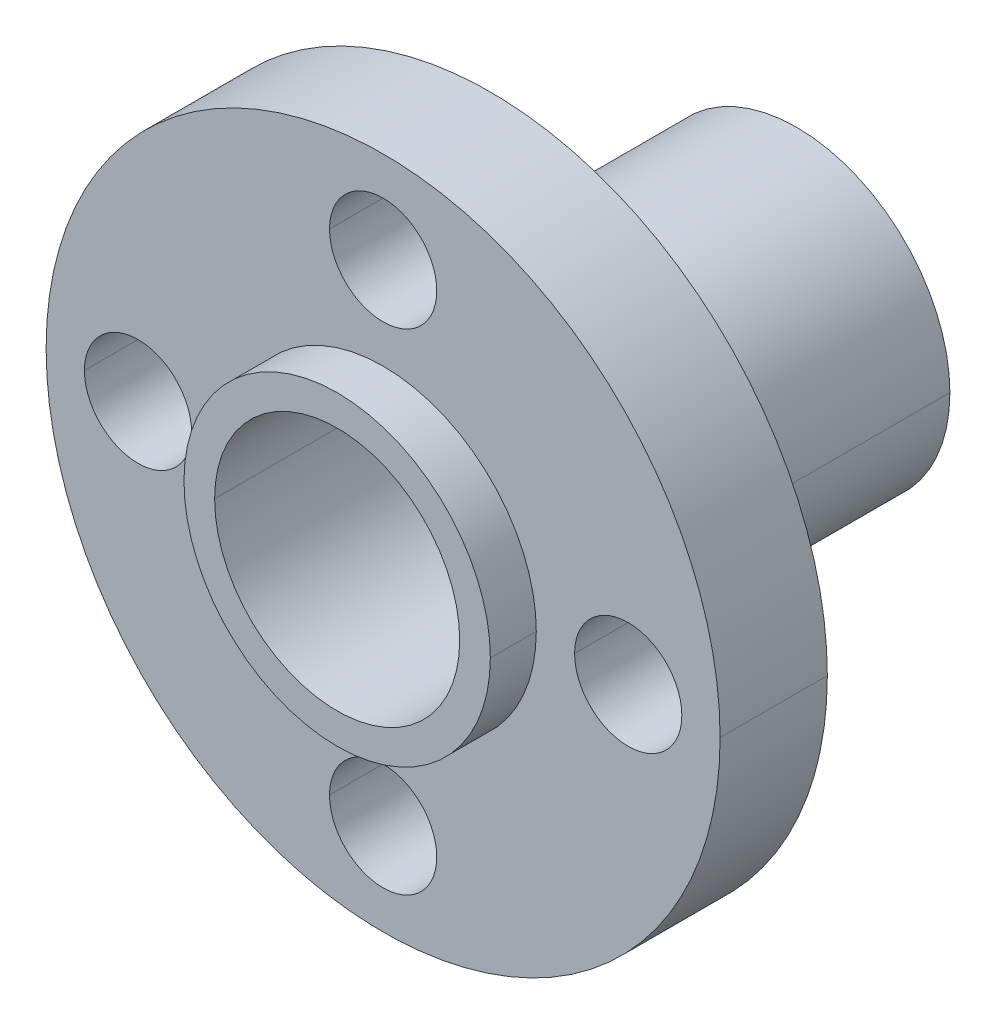
ISO-10303-21;
HEADER;
FILE_DESCRIPTION(('STEP AP214'),'2;1');
FILE_NAME('part.step','',(''),(''),'','','');
FILE_SCHEMA(('AUTOMOTIVE_DESIGN { 1 0 10303 214 1 1 1 1 }'));
ENDSEC;
DATA;
#1=APPLICATION_CONTEXT('core data for automotive mechanical design processes');
#2=APPLICATION_PROTOCOL_DEFINITION('international standard','automotive_design',2000,#1);
#3=PRODUCT_CONTEXT('',#1,'mechanical');
#4=PRODUCT('Part','Part','',(#3));
#5=PRODUCT_RELATED_PRODUCT_CATEGORY('part','',(#4));
#6=PRODUCT_DEFINITION_FORMATION('','',#4);
#7=PRODUCT_DEFINITION_CONTEXT('part definition',#1,'design');
#8=PRODUCT_DEFINITION('design','',#6,#7);
#9=PRODUCT_DEFINITION_SHAPE('','',#8);
#10=(LENGTH_UNIT() NAMED_UNIT(*) SI_UNIT(.MILLI.,.METRE.));
#11=(NAMED_UNIT(*) PLANE_ANGLE_UNIT() SI_UNIT($,.RADIAN.));
#12=(NAMED_UNIT(*) SI_UNIT($,.STERADIAN.) SOLID_ANGLE_UNIT());
#13=UNCERTAINTY_MEASURE_WITH_UNIT(LENGTH_MEASURE(1.E-05),#10,'distance_accuracy_value','');
#14=(GEOMETRIC_REPRESENTATION_CONTEXT(3) GLOBAL_UNCERTAINTY_ASSIGNED_CONTEXT((#13)) GLOBAL_UNIT_ASSIGNED_CONTEXT((#10,
#11,#12)) REPRESENTATION_CONTEXT('',''));
#15=CARTESIAN_POINT('',(0.,0.,0.));
#16=DIRECTION('',(0.,0.,1.));
#17=DIRECTION('',(1.,0.,0.));
#18=AXIS2_PLACEMENT_3D('',#15,#16,#17);
#19=CARTESIAN_POINT('',(0.,0.,-10.));
#20=DIRECTION('',(0.,0.,1.));
#21=DIRECTION('',(1.,0.,0.));
#22=AXIS2_PLACEMENT_3D('',#19,#20,#21);
#23=CYLINDRICAL_SURFACE('',#22,5.);
#24=CARTESIAN_POINT('',(0.,0.,-10.));
#25=DIRECTION('',(0.,0.,1.));
#26=DIRECTION('',(1.,0.,0.));
#27=AXIS2_PLACEMENT_3D('',#24,#25,#26);
#28=CIRCLE('',#27,5.);
#29=CARTESIAN_POINT('',(5.,0.,-10.));
#30=VERTEX_POINT('',#29);
#31=CARTESIAN_POINT('',(-5.,0.,-10.));
#32=VERTEX_POINT('',#31);
#33=EDGE_CURVE('E230',#30,#32,#28,.T.);
#34=ORIENTED_EDGE('',*,*,#33,.T.);
#35=DIRECTION('',(0.,0.,1.));
#36=VECTOR('',#35,1.);
#37=CARTESIAN_POINT('',(-5.,0.,-10.));
#38=LINE('',#37,#36);
#39=CARTESIAN_POINT('',(-5.,0.,0.));
#40=VERTEX_POINT('',#39);
#41=EDGE_CURVE('E223',#32,#40,#38,.T.);
#42=ORIENTED_EDGE('',*,*,#41,.T.);
#43=CARTESIAN_POINT('',(0.,0.,0.));
#44=DIRECTION('',(0.,0.,1.));
#45=DIRECTION('',(1.,0.,0.));
#46=AXIS2_PLACEMENT_3D('',#43,#44,#45);
#47=CIRCLE('',#46,5.);
#48=CARTESIAN_POINT('',(5.,0.,0.));
#49=VERTEX_POINT('',#48);
#50=EDGE_CURVE('E266',#49,#40,#47,.T.);
#51=ORIENTED_EDGE('',*,*,#50,.F.);
#52=DIRECTION('',(0.,0.,1.));
#53=VECTOR('',#52,1.);
#54=CARTESIAN_POINT('',(5.,0.,-10.));
#55=LINE('',#54,#53);
#56=EDGE_CURVE('E252',#30,#49,#55,.T.);
#57=ORIENTED_EDGE('',*,*,#56,.F.);
#58=EDGE_LOOP('',(#34,#42,#51,#57));
#59=FACE_BOUND('',#58,.T.);
#60=ADVANCED_FACE('F16',(#59),#23,.T.);
#61=CARTESIAN_POINT('',(0.,0.,5.));
#62=DIRECTION('',(0.,0.,-1.));
#63=DIRECTION('',(-1.,0.,0.));
#64=AXIS2_PLACEMENT_3D('',#61,#62,#63);
#65=CYLINDRICAL_SURFACE('',#64,5.);
#66=CARTESIAN_POINT('',(0.,0.,5.));
#67=DIRECTION('',(0.,0.,1.));
#68=DIRECTION('',(1.,0.,0.));
#69=AXIS2_PLACEMENT_3D('',#66,#67,#68);
#70=CIRCLE('',#69,5.);
#71=CARTESIAN_POINT('',(5.,0.,5.));
#72=VERTEX_POINT('',#71);
#73=CARTESIAN_POINT('',(-5.,0.,5.));
#74=VERTEX_POINT('',#73);
#75=EDGE_CURVE('E273',#72,#74,#70,.T.);
#76=ORIENTED_EDGE('',*,*,#75,.F.);
#77=DIRECTION('',(0.,0.,-1.));
#78=VECTOR('',#77,1.);
#79=CARTESIAN_POINT('',(5.,0.,5.));
#80=LINE('',#79,#78);
#81=CARTESIAN_POINT('',(5.,0.,3.5));
#82=VERTEX_POINT('',#81);
#83=EDGE_CURVE('E354',#72,#82,#80,.T.);
#84=ORIENTED_EDGE('',*,*,#83,.T.);
#85=CARTESIAN_POINT('',(0.,0.,3.5));
#86=DIRECTION('',(0.,0.,1.));
#87=DIRECTION('',(1.,0.,0.));
#88=AXIS2_PLACEMENT_3D('',#85,#86,#87);
#89=CIRCLE('',#88,5.);
#90=CARTESIAN_POINT('',(-5.,0.,3.5));
#91=VERTEX_POINT('',#90);
#92=EDGE_CURVE('E128',#82,#91,#89,.T.);
#93=ORIENTED_EDGE('',*,*,#92,.T.);
#94=DIRECTION('',(0.,0.,-1.));
#95=VECTOR('',#94,1.);
#96=CARTESIAN_POINT('',(-5.,0.,5.));
#97=LINE('',#96,#95);
#98=EDGE_CURVE('E301',#74,#91,#97,.T.);
#99=ORIENTED_EDGE('',*,*,#98,.F.);
#100=EDGE_LOOP('',(#76,#84,#93,#99));
#101=FACE_BOUND('',#100,.T.);
#102=ADVANCED_FACE('F600',(#101),#65,.T.);
#103=CARTESIAN_POINT('',(0.,0.,5.));
#104=DIRECTION('',(0.,0.,-1.));
#105=DIRECTION('',(-1.,0.,0.));
#106=AXIS2_PLACEMENT_3D('',#103,#104,#105);
#107=CYLINDRICAL_SURFACE('',#106,4.);
#108=CARTESIAN_POINT('',(0.,0.,5.));
#109=DIRECTION('',(0.,0.,1.));
#110=DIRECTION('',(1.,0.,0.));
#111=AXIS2_PLACEMENT_3D('',#108,#109,#110);
#112=CIRCLE('',#111,4.);
#113=CARTESIAN_POINT('',(-4.,0.,5.));
#114=VERTEX_POINT('',#113);
#115=CARTESIAN_POINT('',(4.,0.,5.));
#116=VERTEX_POINT('',#115);
#117=EDGE_CURVE('E276',#114,#116,#112,.T.);
#118=ORIENTED_EDGE('',*,*,#117,.T.);
#119=DIRECTION('',(0.,0.,-1.));
#120=VECTOR('',#119,1.);
#121=CARTESIAN_POINT('',(4.,0.,5.));
#122=LINE('',#121,#120);
#123=CARTESIAN_POINT('',(4.,0.,-10.));
#124=VERTEX_POINT('',#123);
#125=EDGE_CURVE('E225',#116,#124,#122,.T.);
#126=ORIENTED_EDGE('',*,*,#125,.T.);
#127=CARTESIAN_POINT('',(0.,0.,-10.));
#128=DIRECTION('',(0.,0.,1.));
#129=DIRECTION('',(1.,0.,0.));
#130=AXIS2_PLACEMENT_3D('',#127,#128,#129);
#131=CIRCLE('',#130,4.);
#132=CARTESIAN_POINT('',(-4.,0.,-10.));
#133=VERTEX_POINT('',#132);
#134=EDGE_CURVE('E242',#133,#124,#131,.T.);
#135=ORIENTED_EDGE('',*,*,#134,.F.);
#136=DIRECTION('',(0.,0.,-1.));
#137=VECTOR('',#136,1.);
#138=CARTESIAN_POINT('',(-4.,0.,5.));
#139=LINE('',#138,#137);
#140=EDGE_CURVE('E228',#114,#133,#139,.T.);
#141=ORIENTED_EDGE('',*,*,#140,.F.);
#142=EDGE_LOOP('',(#118,#126,#135,#141));
#143=FACE_BOUND('',#142,.T.);
#144=ADVANCED_FACE('F374',(#143),#107,.F.);
#145=CARTESIAN_POINT('',(0.,0.,3.5));
#146=DIRECTION('',(0.,0.,-1.));
#147=DIRECTION('',(-1.,0.,0.));
#148=AXIS2_PLACEMENT_3D('',#145,#146,#147);
#149=CYLINDRICAL_SURFACE('',#148,11.);
#150=CARTESIAN_POINT('',(0.,0.,3.5));
#151=DIRECTION('',(0.,0.,1.));
#152=DIRECTION('',(1.,0.,0.));
#153=AXIS2_PLACEMENT_3D('',#150,#151,#152);
#154=CIRCLE('',#153,11.);
#155=CARTESIAN_POINT('',(11.,0.,3.5));
#156=VERTEX_POINT('',#155);
#157=CARTESIAN_POINT('',(-11.,0.,3.5));
#158=VERTEX_POINT('',#157);
#159=EDGE_CURVE('E308',#156,#158,#154,.T.);
#160=ORIENTED_EDGE('',*,*,#159,.F.);
#161=DIRECTION('',(0.,0.,-1.));
#162=VECTOR('',#161,1.);
#163=CARTESIAN_POINT('',(11.,0.,3.5));
#164=LINE('',#163,#162);
#165=CARTESIAN_POINT('',(11.,0.,0.));
#166=VERTEX_POINT('',#165);
#167=EDGE_CURVE('E177',#156,#166,#164,.T.);
#168=ORIENTED_EDGE('',*,*,#167,.T.);
#169=CARTESIAN_POINT('',(0.,0.,0.));
#170=DIRECTION('',(0.,0.,1.));
#171=DIRECTION('',(1.,0.,0.));
#172=AXIS2_PLACEMENT_3D('',#169,#170,#171);
#173=CIRCLE('',#172,11.);
#174=CARTESIAN_POINT('',(-11.,0.,0.));
#175=VERTEX_POINT('',#174);
#176=EDGE_CURVE('E330',#166,#175,#173,.T.);
#177=ORIENTED_EDGE('',*,*,#176,.T.);
#178=DIRECTION('',(0.,0.,-1.));
#179=VECTOR('',#178,1.);
#180=CARTESIAN_POINT('',(-11.,0.,3.5));
#181=LINE('',#180,#179);
#182=EDGE_CURVE('E320',#158,#175,#181,.T.);
#183=ORIENTED_EDGE('',*,*,#182,.F.);
#184=EDGE_LOOP('',(#160,#168,#177,#183));
#185=FACE_BOUND('',#184,.T.);
#186=ADVANCED_FACE('F18',(#185),#149,.T.);
#187=CARTESIAN_POINT('',(-7.9999999999998,-2.07980123376795E-13,3.5));
#188=DIRECTION('',(0.,0.,-1.));
#189=DIRECTION('',(-1.,0.,0.));
#190=AXIS2_PLACEMENT_3D('',#187,#188,#189);
#191=CYLINDRICAL_SURFACE('',#190,1.75);
#192=CARTESIAN_POINT('',(-7.9999999999998,-2.07980123376795E-13,3.5));
#193=DIRECTION('',(0.,0.,1.));
#194=DIRECTION('',(1.,0.,0.));
#195=AXIS2_PLACEMENT_3D('',#192,#193,#194);
#196=CIRCLE('',#195,1.75);
#197=CARTESIAN_POINT('',(-9.74999999999979,-2.07980123376795E-13,3.5));
#198=VERTEX_POINT('',#197);
#199=CARTESIAN_POINT('',(-6.24999999999979,-2.07765810186945E-13,3.5));
#200=VERTEX_POINT('',#199);
#201=EDGE_CURVE('E207',#198,#200,#196,.T.);
#202=ORIENTED_EDGE('',*,*,#201,.T.);
#203=DIRECTION('',(0.,0.,-1.));
#204=VECTOR('',#203,1.);
#205=CARTESIAN_POINT('',(-6.24999999999979,-2.07765810186945E-13,3.5));
#206=LINE('',#205,#204);
#207=CARTESIAN_POINT('',(-6.24999999999979,-2.07765810186945E-13,0.));
#208=VERTEX_POINT('',#207);
#209=EDGE_CURVE('E41',#200,#208,#206,.T.);
#210=ORIENTED_EDGE('',*,*,#209,.T.);
#211=CARTESIAN_POINT('',(-7.9999999999998,-2.07980123376795E-13,0.));
#212=DIRECTION('',(0.,0.,1.));
#213=DIRECTION('',(1.,0.,0.));
#214=AXIS2_PLACEMENT_3D('',#211,#212,#213);
#215=CIRCLE('',#214,1.75);
#216=CARTESIAN_POINT('',(-9.74999999999979,-2.07980123376795E-13,0.));
#217=VERTEX_POINT('',#216);
#218=EDGE_CURVE('E235',#217,#208,#215,.T.);
#219=ORIENTED_EDGE('',*,*,#218,.F.);
#220=DIRECTION('',(0.,0.,-1.));
#221=VECTOR('',#220,1.);
#222=CARTESIAN_POINT('',(-9.74999999999979,-2.07980123376795E-13,3.5));
#223=LINE('',#222,#221);
#224=EDGE_CURVE('E200',#198,#217,#223,.T.);
#225=ORIENTED_EDGE('',*,*,#224,.F.);
#226=EDGE_LOOP('',(#202,#210,#219,#225));
#227=FACE_BOUND('',#226,.T.);
#228=ADVANCED_FACE('F388',(#227),#191,.F.);
#229=CARTESIAN_POINT('',(4.14000811874955E-13,-8.,3.5));
#230=DIRECTION('',(0.,0.,-1.));
#231=DIRECTION('',(-1.,0.,0.));
#232=AXIS2_PLACEMENT_3D('',#229,#230,#231);
#233=CYLINDRICAL_SURFACE('',#232,1.75);
#234=CARTESIAN_POINT('',(4.14000811874955E-13,-8.,3.5));
#235=DIRECTION('',(0.,0.,1.));
#236=DIRECTION('',(1.,0.,0.));
#237=AXIS2_PLACEMENT_3D('',#234,#235,#236);
#238=CIRCLE('',#237,1.75);
#239=CARTESIAN_POINT('',(-1.74999999999958,-8.,3.5));
#240=VERTEX_POINT('',#239);
#241=CARTESIAN_POINT('',(1.75000000000042,-8.,3.5));
#242=VERTEX_POINT('',#241);
#243=EDGE_CURVE('E205',#240,#242,#238,.T.);
#244=ORIENTED_EDGE('',*,*,#243,.T.);
#245=DIRECTION('',(0.,0.,-1.));
#246=VECTOR('',#245,1.);
#247=CARTESIAN_POINT('',(1.75000000000042,-8.,3.5));
#248=LINE('',#247,#246);
#249=CARTESIAN_POINT('',(1.75000000000042,-8.,0.));
#250=VERTEX_POINT('',#249);
#251=EDGE_CURVE('E187',#242,#250,#248,.T.);
#252=ORIENTED_EDGE('',*,*,#251,.T.);
#253=CARTESIAN_POINT('',(4.14000811874955E-13,-8.,0.));
#254=DIRECTION('',(0.,0.,1.));
#255=DIRECTION('',(1.,0.,0.));
#256=AXIS2_PLACEMENT_3D('',#253,#254,#255);
#257=CIRCLE('',#256,1.75);
#258=CARTESIAN_POINT('',(-1.74999999999958,-8.,0.));
#259=VERTEX_POINT('',#258);
#260=EDGE_CURVE('E20',#259,#250,#257,.T.);
#261=ORIENTED_EDGE('',*,*,#260,.F.);
#262=DIRECTION('',(0.,0.,-1.));
#263=VECTOR('',#262,1.);
#264=CARTESIAN_POINT('',(-1.74999999999958,-8.,3.5));
#265=LINE('',#264,#263);
#266=EDGE_CURVE('E199',#240,#259,#265,.T.);
#267=ORIENTED_EDGE('',*,*,#266,.F.);
#268=EDGE_LOOP('',(#244,#252,#261,#267));
#269=FACE_BOUND('',#268,.T.);
#270=ADVANCED_FACE('F209',(#269),#233,.F.);
#271=CARTESIAN_POINT('',(8.00000000000021,2.07000405937477E-13,3.5));
#272=DIRECTION('',(0.,0.,-1.));
#273=DIRECTION('',(-1.,0.,0.));
#274=AXIS2_PLACEMENT_3D('',#271,#272,#273);
#275=CYLINDRICAL_SURFACE('',#274,1.75);
#276=CARTESIAN_POINT('',(8.00000000000021,2.07000405937477E-13,3.5));
#277=DIRECTION('',(0.,0.,1.));
#278=DIRECTION('',(1.,0.,0.));
#279=AXIS2_PLACEMENT_3D('',#276,#277,#278);
#280=CIRCLE('',#279,1.75);
#281=CARTESIAN_POINT('',(6.25000000000021,2.07000405937477E-13,3.5));
#282=VERTEX_POINT('',#281);
#283=CARTESIAN_POINT('',(9.75000000000021,2.07214719127328E-13,3.5));
#284=VERTEX_POINT('',#283);
#285=EDGE_CURVE('E219',#282,#284,#280,.T.);
#286=ORIENTED_EDGE('',*,*,#285,.T.);
#287=DIRECTION('',(0.,0.,-1.));
#288=VECTOR('',#287,1.);
#289=CARTESIAN_POINT('',(9.75000000000021,2.07214719127328E-13,3.5));
#290=LINE('',#289,#288);
#291=CARTESIAN_POINT('',(9.75000000000021,2.07214719127328E-13,0.));
#292=VERTEX_POINT('',#291);
#293=EDGE_CURVE('E312',#284,#292,#290,.T.);
#294=ORIENTED_EDGE('',*,*,#293,.T.);
#295=CARTESIAN_POINT('',(8.00000000000021,2.07000405937477E-13,0.));
#296=DIRECTION('',(0.,0.,1.));
#297=DIRECTION('',(1.,0.,0.));
#298=AXIS2_PLACEMENT_3D('',#295,#296,#297);
#299=CIRCLE('',#298,1.75);
#300=CARTESIAN_POINT('',(6.25000000000021,2.07000405937477E-13,0.));
#301=VERTEX_POINT('',#300);
#302=EDGE_CURVE('E270',#301,#292,#299,.T.);
#303=ORIENTED_EDGE('',*,*,#302,.F.);
#304=DIRECTION('',(0.,0.,-1.));
#305=VECTOR('',#304,1.);
#306=CARTESIAN_POINT('',(6.25000000000021,2.07000405937477E-13,3.5));
#307=LINE('',#306,#305);
#308=EDGE_CURVE('E316',#282,#301,#307,.T.);
#309=ORIENTED_EDGE('',*,*,#308,.F.);
#310=EDGE_LOOP('',(#286,#294,#303,#309));
#311=FACE_BOUND('',#310,.T.);
#312=ADVANCED_FACE('F401',(#311),#275,.F.);
#313=CARTESIAN_POINT('',(0.,8.,3.5));
#314=DIRECTION('',(0.,0.,-1.));
#315=DIRECTION('',(-1.,0.,0.));
#316=AXIS2_PLACEMENT_3D('',#313,#314,#315);
#317=CYLINDRICAL_SURFACE('',#316,1.75);
#318=CARTESIAN_POINT('',(0.,8.,3.5));
#319=DIRECTION('',(0.,0.,1.));
#320=DIRECTION('',(1.,0.,0.));
#321=AXIS2_PLACEMENT_3D('',#318,#319,#320);
#322=CIRCLE('',#321,1.75);
#323=CARTESIAN_POINT('',(-1.75,8.,3.5));
#324=VERTEX_POINT('',#323);
#325=CARTESIAN_POINT('',(1.75,8.,3.5));
#326=VERTEX_POINT('',#325);
#327=EDGE_CURVE('E304',#324,#326,#322,.T.);
#328=ORIENTED_EDGE('',*,*,#327,.T.);
#329=DIRECTION('',(0.,0.,-1.));
#330=VECTOR('',#329,1.);
#331=CARTESIAN_POINT('',(1.75,8.,3.5));
#332=LINE('',#331,#330);
#333=CARTESIAN_POINT('',(1.75,8.,0.));
#334=VERTEX_POINT('',#333);
#335=EDGE_CURVE('E27',#326,#334,#332,.T.);
#336=ORIENTED_EDGE('',*,*,#335,.T.);
#337=CARTESIAN_POINT('',(0.,8.,0.));
#338=DIRECTION('',(0.,0.,1.));
#339=DIRECTION('',(1.,0.,0.));
#340=AXIS2_PLACEMENT_3D('',#337,#338,#339);
#341=CIRCLE('',#340,1.75);
#342=CARTESIAN_POINT('',(-1.75,8.,0.));
#343=VERTEX_POINT('',#342);
#344=EDGE_CURVE('E327',#343,#334,#341,.T.);
#345=ORIENTED_EDGE('',*,*,#344,.F.);
#346=DIRECTION('',(0.,0.,-1.));
#347=VECTOR('',#346,1.);
#348=CARTESIAN_POINT('',(-1.75,8.,3.5));
#349=LINE('',#348,#347);
#350=EDGE_CURVE('E11',#324,#343,#349,.T.);
#351=ORIENTED_EDGE('',*,*,#350,.F.);
#352=EDGE_LOOP('',(#328,#336,#345,#351));
#353=FACE_BOUND('',#352,.T.);
#354=ADVANCED_FACE('F339',(#353),#317,.F.);
#355=CARTESIAN_POINT('',(0.,8.,3.5));
#356=DIRECTION('',(0.,0.,-1.));
#357=DIRECTION('',(-1.,0.,0.));
#358=AXIS2_PLACEMENT_3D('',#355,#356,#357);
#359=CYLINDRICAL_SURFACE('',#358,1.75);
#360=ORIENTED_EDGE('',*,*,#335,.F.);
#361=CARTESIAN_POINT('',(0.,8.,3.5));
#362=DIRECTION('',(0.,0.,1.));
#363=DIRECTION('',(1.,0.,0.));
#364=AXIS2_PLACEMENT_3D('',#361,#362,#363);
#365=CIRCLE('',#364,1.75);
#366=EDGE_CURVE('E302',#326,#324,#365,.T.);
#367=ORIENTED_EDGE('',*,*,#366,.T.);
#368=ORIENTED_EDGE('',*,*,#350,.T.);
#369=CARTESIAN_POINT('',(0.,8.,0.));
#370=DIRECTION('',(0.,0.,1.));
#371=DIRECTION('',(1.,0.,0.));
#372=AXIS2_PLACEMENT_3D('',#369,#370,#371);
#373=CIRCLE('',#372,1.75);
#374=EDGE_CURVE('E326',#334,#343,#373,.T.);
#375=ORIENTED_EDGE('',*,*,#374,.F.);
#376=EDGE_LOOP('',(#360,#367,#368,#375));
#377=FACE_BOUND('',#376,.T.);
#378=ADVANCED_FACE('F605',(#377),#359,.F.);
#379=CARTESIAN_POINT('',(8.00000000000021,2.07000405937477E-13,3.5));
#380=DIRECTION('',(0.,0.,-1.));
#381=DIRECTION('',(-1.,0.,0.));
#382=AXIS2_PLACEMENT_3D('',#379,#380,#381);
#383=CYLINDRICAL_SURFACE('',#382,1.75);
#384=ORIENTED_EDGE('',*,*,#293,.F.);
#385=CARTESIAN_POINT('',(8.00000000000021,2.07000405937477E-13,3.5));
#386=DIRECTION('',(0.,0.,1.));
#387=DIRECTION('',(1.,0.,0.));
#388=AXIS2_PLACEMENT_3D('',#385,#386,#387);
#389=CIRCLE('',#388,1.75);
#390=EDGE_CURVE('E211',#284,#282,#389,.T.);
#391=ORIENTED_EDGE('',*,*,#390,.T.);
#392=ORIENTED_EDGE('',*,*,#308,.T.);
#393=CARTESIAN_POINT('',(8.00000000000021,2.07000405937477E-13,0.));
#394=DIRECTION('',(0.,0.,1.));
#395=DIRECTION('',(1.,0.,0.));
#396=AXIS2_PLACEMENT_3D('',#393,#394,#395);
#397=CIRCLE('',#396,1.75);
#398=EDGE_CURVE('E267',#292,#301,#397,.T.);
#399=ORIENTED_EDGE('',*,*,#398,.F.);
#400=EDGE_LOOP('',(#384,#391,#392,#399));
#401=FACE_BOUND('',#400,.T.);
#402=ADVANCED_FACE('F405',(#401),#383,.F.);
#403=CARTESIAN_POINT('',(4.14000811874955E-13,-8.,3.5));
#404=DIRECTION('',(0.,0.,-1.));
#405=DIRECTION('',(-1.,0.,0.));
#406=AXIS2_PLACEMENT_3D('',#403,#404,#405);
#407=CYLINDRICAL_SURFACE('',#406,1.75);
#408=ORIENTED_EDGE('',*,*,#251,.F.);
#409=CARTESIAN_POINT('',(4.14000811874955E-13,-8.,3.5));
#410=DIRECTION('',(0.,0.,1.));
#411=DIRECTION('',(1.,0.,0.));
#412=AXIS2_PLACEMENT_3D('',#409,#410,#411);
#413=CIRCLE('',#412,1.75);
#414=EDGE_CURVE('E190',#242,#240,#413,.T.);
#415=ORIENTED_EDGE('',*,*,#414,.T.);
#416=ORIENTED_EDGE('',*,*,#266,.T.);
#417=CARTESIAN_POINT('',(4.14000811874955E-13,-8.,0.));
#418=DIRECTION('',(0.,0.,1.));
#419=DIRECTION('',(1.,0.,0.));
#420=AXIS2_PLACEMENT_3D('',#417,#418,#419);
#421=CIRCLE('',#420,1.75);
#422=EDGE_CURVE('E193',#250,#259,#421,.T.);
#423=ORIENTED_EDGE('',*,*,#422,.F.);
#424=EDGE_LOOP('',(#408,#415,#416,#423));
#425=FACE_BOUND('',#424,.T.);
#426=ADVANCED_FACE('F189',(#425),#407,.F.);
#427=CARTESIAN_POINT('',(-7.9999999999998,-2.07980123376795E-13,3.5));
#428=DIRECTION('',(0.,0.,-1.));
#429=DIRECTION('',(-1.,0.,0.));
#430=AXIS2_PLACEMENT_3D('',#427,#428,#429);
#431=CYLINDRICAL_SURFACE('',#430,1.75);
#432=ORIENTED_EDGE('',*,*,#209,.F.);
#433=CARTESIAN_POINT('',(-7.9999999999998,-2.07980123376795E-13,3.5));
#434=DIRECTION('',(0.,0.,1.));
#435=DIRECTION('',(1.,0.,0.));
#436=AXIS2_PLACEMENT_3D('',#433,#434,#435);
#437=CIRCLE('',#436,1.75);
#438=EDGE_CURVE('E359',#200,#198,#437,.T.);
#439=ORIENTED_EDGE('',*,*,#438,.T.);
#440=ORIENTED_EDGE('',*,*,#224,.T.);
#441=CARTESIAN_POINT('',(-7.9999999999998,-2.07980123376795E-13,0.));
#442=DIRECTION('',(0.,0.,1.));
#443=DIRECTION('',(1.,0.,0.));
#444=AXIS2_PLACEMENT_3D('',#441,#442,#443);
#445=CIRCLE('',#444,1.75);
#446=EDGE_CURVE('E238',#208,#217,#445,.T.);
#447=ORIENTED_EDGE('',*,*,#446,.F.);
#448=EDGE_LOOP('',(#432,#439,#440,#447));
#449=FACE_BOUND('',#448,.T.);
#450=ADVANCED_FACE('F391',(#449),#431,.F.);
#451=CARTESIAN_POINT('',(0.,0.,3.5));
#452=DIRECTION('',(0.,0.,-1.));
#453=DIRECTION('',(-1.,0.,0.));
#454=AXIS2_PLACEMENT_3D('',#451,#452,#453);
#455=CYLINDRICAL_SURFACE('',#454,11.);
#456=ORIENTED_EDGE('',*,*,#167,.F.);
#457=CARTESIAN_POINT('',(0.,0.,3.5));
#458=DIRECTION('',(0.,0.,1.));
#459=DIRECTION('',(1.,0.,0.));
#460=AXIS2_PLACEMENT_3D('',#457,#458,#459);
#461=CIRCLE('',#460,11.);
#462=EDGE_CURVE('E272',#158,#156,#461,.T.);
#463=ORIENTED_EDGE('',*,*,#462,.F.);
#464=ORIENTED_EDGE('',*,*,#182,.T.);
#465=CARTESIAN_POINT('',(0.,0.,0.));
#466=DIRECTION('',(0.,0.,1.));
#467=DIRECTION('',(1.,0.,0.));
#468=AXIS2_PLACEMENT_3D('',#465,#466,#467);
#469=CIRCLE('',#468,11.);
#470=EDGE_CURVE('E360',#175,#166,#469,.T.);
#471=ORIENTED_EDGE('',*,*,#470,.T.);
#472=EDGE_LOOP('',(#456,#463,#464,#471));
#473=FACE_BOUND('',#472,.T.);
#474=ADVANCED_FACE('F408',(#473),#455,.T.);
#475=CARTESIAN_POINT('',(0.,0.,3.5));
#476=DIRECTION('',(0.,0.,1.));
#477=DIRECTION('',(1.,0.,0.));
#478=AXIS2_PLACEMENT_3D('',#475,#476,#477);
#479=PLANE('',#478);
#480=ORIENTED_EDGE('',*,*,#201,.F.);
#481=ORIENTED_EDGE('',*,*,#438,.F.);
#482=EDGE_LOOP('',(#480,#481));
#483=FACE_BOUND('',#482,.T.);
#484=ORIENTED_EDGE('',*,*,#243,.F.);
#485=ORIENTED_EDGE('',*,*,#414,.F.);
#486=EDGE_LOOP('',(#484,#485));
#487=FACE_BOUND('',#486,.T.);
#488=ORIENTED_EDGE('',*,*,#285,.F.);
#489=ORIENTED_EDGE('',*,*,#390,.F.);
#490=EDGE_LOOP('',(#488,#489));
#491=FACE_BOUND('',#490,.T.);
#492=ORIENTED_EDGE('',*,*,#327,.F.);
#493=ORIENTED_EDGE('',*,*,#366,.F.);
#494=EDGE_LOOP('',(#492,#493));
#495=FACE_BOUND('',#494,.T.);
#496=CARTESIAN_POINT('',(0.,0.,3.5));
#497=DIRECTION('',(0.,0.,1.));
#498=DIRECTION('',(1.,0.,0.));
#499=AXIS2_PLACEMENT_3D('',#496,#497,#498);
#500=CIRCLE('',#499,5.);
#501=EDGE_CURVE('E229',#91,#82,#500,.T.);
#502=ORIENTED_EDGE('',*,*,#501,.F.);
#503=ORIENTED_EDGE('',*,*,#92,.F.);
#504=EDGE_LOOP('',(#502,#503));
#505=FACE_BOUND('',#504,.T.);
#506=ORIENTED_EDGE('',*,*,#462,.T.);
#507=ORIENTED_EDGE('',*,*,#159,.T.);
#508=EDGE_LOOP('',(#506,#507));
#509=FACE_BOUND('',#508,.T.);
#510=ADVANCED_FACE('F203',(#483,#487,#491,#495,#505,#509),#479,.T.);
#511=CARTESIAN_POINT('',(0.,0.,0.));
#512=DIRECTION('',(0.,0.,1.));
#513=DIRECTION('',(1.,0.,0.));
#514=AXIS2_PLACEMENT_3D('',#511,#512,#513);
#515=PLANE('',#514);
#516=ORIENTED_EDGE('',*,*,#50,.T.);
#517=CARTESIAN_POINT('',(0.,0.,0.));
#518=DIRECTION('',(0.,0.,1.));
#519=DIRECTION('',(1.,0.,0.));
#520=AXIS2_PLACEMENT_3D('',#517,#518,#519);
#521=CIRCLE('',#520,5.);
#522=EDGE_CURVE('E289',#40,#49,#521,.T.);
#523=ORIENTED_EDGE('',*,*,#522,.T.);
#524=EDGE_LOOP('',(#516,#523));
#525=FACE_BOUND('',#524,.T.);
#526=ORIENTED_EDGE('',*,*,#218,.T.);
#527=ORIENTED_EDGE('',*,*,#446,.T.);
#528=EDGE_LOOP('',(#526,#527));
#529=FACE_BOUND('',#528,.T.);
#530=ORIENTED_EDGE('',*,*,#260,.T.);
#531=ORIENTED_EDGE('',*,*,#422,.T.);
#532=EDGE_LOOP('',(#530,#531));
#533=FACE_BOUND('',#532,.T.);
#534=ORIENTED_EDGE('',*,*,#302,.T.);
#535=ORIENTED_EDGE('',*,*,#398,.T.);
#536=EDGE_LOOP('',(#534,#535));
#537=FACE_BOUND('',#536,.T.);
#538=ORIENTED_EDGE('',*,*,#344,.T.);
#539=ORIENTED_EDGE('',*,*,#374,.T.);
#540=EDGE_LOOP('',(#538,#539));
#541=FACE_BOUND('',#540,.T.);
#542=ORIENTED_EDGE('',*,*,#470,.F.);
#543=ORIENTED_EDGE('',*,*,#176,.F.);
#544=EDGE_LOOP('',(#542,#543));
#545=FACE_BOUND('',#544,.T.);
#546=ADVANCED_FACE('F335',(#525,#529,#533,#537,#541,#545),#515,.F.);
#547=CARTESIAN_POINT('',(0.,0.,5.));
#548=DIRECTION('',(0.,0.,-1.));
#549=DIRECTION('',(-1.,0.,0.));
#550=AXIS2_PLACEMENT_3D('',#547,#548,#549);
#551=CYLINDRICAL_SURFACE('',#550,4.);
#552=ORIENTED_EDGE('',*,*,#125,.F.);
#553=CARTESIAN_POINT('',(0.,0.,5.));
#554=DIRECTION('',(0.,0.,1.));
#555=DIRECTION('',(1.,0.,0.));
#556=AXIS2_PLACEMENT_3D('',#553,#554,#555);
#557=CIRCLE('',#556,4.);
#558=EDGE_CURVE('E286',#116,#114,#557,.T.);
#559=ORIENTED_EDGE('',*,*,#558,.T.);
#560=ORIENTED_EDGE('',*,*,#140,.T.);
#561=CARTESIAN_POINT('',(0.,0.,-10.));
#562=DIRECTION('',(0.,0.,1.));
#563=DIRECTION('',(1.,0.,0.));
#564=AXIS2_PLACEMENT_3D('',#561,#562,#563);
#565=CIRCLE('',#564,4.);
#566=EDGE_CURVE('E239',#124,#133,#565,.T.);
#567=ORIENTED_EDGE('',*,*,#566,.F.);
#568=EDGE_LOOP('',(#552,#559,#560,#567));
#569=FACE_BOUND('',#568,.T.);
#570=ADVANCED_FACE('F370',(#569),#551,.F.);
#571=CARTESIAN_POINT('',(0.,0.,5.));
#572=DIRECTION('',(0.,0.,-1.));
#573=DIRECTION('',(-1.,0.,0.));
#574=AXIS2_PLACEMENT_3D('',#571,#572,#573);
#575=CYLINDRICAL_SURFACE('',#574,5.);
#576=ORIENTED_EDGE('',*,*,#83,.F.);
#577=CARTESIAN_POINT('',(0.,0.,5.));
#578=DIRECTION('',(0.,0.,1.));
#579=DIRECTION('',(1.,0.,0.));
#580=AXIS2_PLACEMENT_3D('',#577,#578,#579);
#581=CIRCLE('',#580,5.);
#582=EDGE_CURVE('E277',#74,#72,#581,.T.);
#583=ORIENTED_EDGE('',*,*,#582,.F.);
#584=ORIENTED_EDGE('',*,*,#98,.T.);
#585=ORIENTED_EDGE('',*,*,#501,.T.);
#586=EDGE_LOOP('',(#576,#583,#584,#585));
#587=FACE_BOUND('',#586,.T.);
#588=ADVANCED_FACE('F635',(#587),#575,.T.);
#589=CARTESIAN_POINT('',(0.,0.,5.));
#590=DIRECTION('',(0.,0.,1.));
#591=DIRECTION('',(1.,0.,0.));
#592=AXIS2_PLACEMENT_3D('',#589,#590,#591);
#593=PLANE('',#592);
#594=ORIENTED_EDGE('',*,*,#117,.F.);
#595=ORIENTED_EDGE('',*,*,#558,.F.);
#596=EDGE_LOOP('',(#594,#595));
#597=FACE_BOUND('',#596,.T.);
#598=ORIENTED_EDGE('',*,*,#582,.T.);
#599=ORIENTED_EDGE('',*,*,#75,.T.);
#600=EDGE_LOOP('',(#598,#599));
#601=FACE_BOUND('',#600,.T.);
#602=ADVANCED_FACE('F376',(#597,#601),#593,.T.);
#603=CARTESIAN_POINT('',(0.,0.,-10.));
#604=DIRECTION('',(0.,0.,1.));
#605=DIRECTION('',(1.,0.,0.));
#606=AXIS2_PLACEMENT_3D('',#603,#604,#605);
#607=CYLINDRICAL_SURFACE('',#606,5.);
#608=ORIENTED_EDGE('',*,*,#41,.F.);
#609=CARTESIAN_POINT('',(0.,0.,-10.));
#610=DIRECTION('',(0.,0.,1.));
#611=DIRECTION('',(1.,0.,0.));
#612=AXIS2_PLACEMENT_3D('',#609,#610,#611);
#613=CIRCLE('',#612,5.);
#614=EDGE_CURVE('E234',#32,#30,#613,.T.);
#615=ORIENTED_EDGE('',*,*,#614,.T.);
#616=ORIENTED_EDGE('',*,*,#56,.T.);
#617=ORIENTED_EDGE('',*,*,#522,.F.);
#618=EDGE_LOOP('',(#608,#615,#616,#617));
#619=FACE_BOUND('',#618,.T.);
#620=ADVANCED_FACE('F662',(#619),#607,.T.);
#621=CARTESIAN_POINT('',(0.,0.,-10.));
#622=DIRECTION('',(0.,0.,1.));
#623=DIRECTION('',(1.,0.,0.));
#624=AXIS2_PLACEMENT_3D('',#621,#622,#623);
#625=PLANE('',#624);
#626=ORIENTED_EDGE('',*,*,#134,.T.);
#627=ORIENTED_EDGE('',*,*,#566,.T.);
#628=EDGE_LOOP('',(#626,#627));
#629=FACE_BOUND('',#628,.T.);
#630=ORIENTED_EDGE('',*,*,#33,.F.);
#631=ORIENTED_EDGE('',*,*,#614,.F.);
#632=EDGE_LOOP('',(#630,#631));
#633=FACE_BOUND('',#632,.T.);
#634=ADVANCED_FACE('F670',(#629,#633),#625,.F.);
#635=CLOSED_SHELL('',(#60,#102,#144,#186,#228,#270,#312,#354,#378,#402,#426,#450,#474,#510,#546,
#570,#588,#602,#620,#634));
#636=MANIFOLD_SOLID_BREP('B1',#635);
#637=ADVANCED_BREP_SHAPE_REPRESENTATION('',(#18,#636),#14);
#638=SHAPE_DEFINITION_REPRESENTATION(#9,#637);
ENDSEC;
END-ISO-10303-21;
